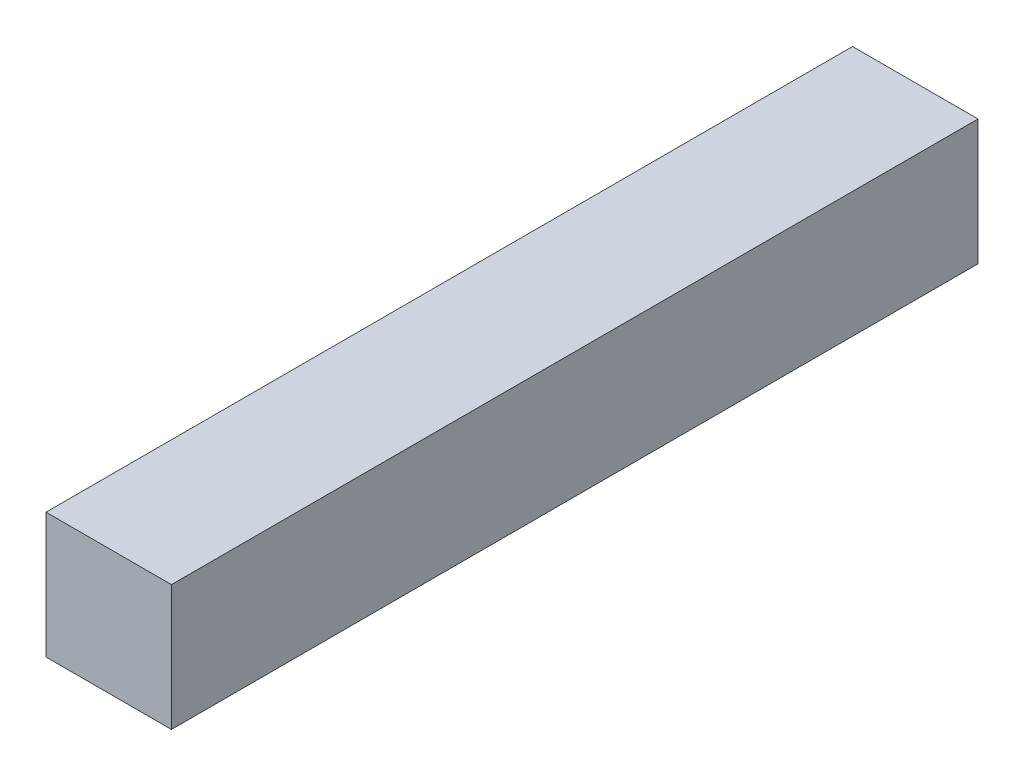
ISO-10303-21;
HEADER;
FILE_DESCRIPTION(('STEP AP214'),'2;1');
FILE_NAME('part.step','',(''),(''),'','','');
FILE_SCHEMA(('AUTOMOTIVE_DESIGN { 1 0 10303 214 1 1 1 1 }'));
ENDSEC;
DATA;
#1=APPLICATION_CONTEXT('core data for automotive mechanical design processes');
#2=APPLICATION_PROTOCOL_DEFINITION('international standard','automotive_design',2000,#1);
#3=PRODUCT_CONTEXT('',#1,'mechanical');
#4=PRODUCT('Part','Part','',(#3));
#5=PRODUCT_RELATED_PRODUCT_CATEGORY('part','',(#4));
#6=PRODUCT_DEFINITION_FORMATION('','',#4);
#7=PRODUCT_DEFINITION_CONTEXT('part definition',#1,'design');
#8=PRODUCT_DEFINITION('design','',#6,#7);
#9=PRODUCT_DEFINITION_SHAPE('','',#8);
#10=(LENGTH_UNIT() NAMED_UNIT(*) SI_UNIT(.MILLI.,.METRE.));
#11=(NAMED_UNIT(*) PLANE_ANGLE_UNIT() SI_UNIT($,.RADIAN.));
#12=(NAMED_UNIT(*) SI_UNIT($,.STERADIAN.) SOLID_ANGLE_UNIT());
#13=UNCERTAINTY_MEASURE_WITH_UNIT(LENGTH_MEASURE(1.E-05),#10,'distance_accuracy_value','');
#14=(GEOMETRIC_REPRESENTATION_CONTEXT(3) GLOBAL_UNCERTAINTY_ASSIGNED_CONTEXT((#13)) GLOBAL_UNIT_ASSIGNED_CONTEXT((#10,
#11,#12)) REPRESENTATION_CONTEXT('',''));
#15=CARTESIAN_POINT('',(0.,0.,0.));
#16=DIRECTION('',(0.,0.,1.));
#17=DIRECTION('',(1.,0.,0.));
#18=AXIS2_PLACEMENT_3D('',#15,#16,#17);
#19=CARTESIAN_POINT('',(0.,0.,18.));
#20=DIRECTION('',(1.,0.,0.));
#21=DIRECTION('',(0.,1.,0.));
#22=AXIS2_PLACEMENT_3D('',#19,#20,#21);
#23=PLANE('',#22);
#24=DIRECTION('',(0.,-1.,0.));
#25=VECTOR('',#24,1.);
#26=CARTESIAN_POINT('',(0.,0.,0.));
#27=LINE('',#26,#25);
#28=CARTESIAN_POINT('',(0.,2.8,0.));
#29=VERTEX_POINT('',#28);
#30=CARTESIAN_POINT('',(0.,0.,0.));
#31=VERTEX_POINT('',#30);
#32=EDGE_CURVE('E102',#29,#31,#27,.T.);
#33=ORIENTED_EDGE('',*,*,#32,.T.);
#34=DIRECTION('',(0.,0.,-1.));
#35=VECTOR('',#34,1.);
#36=CARTESIAN_POINT('',(0.,0.,18.));
#37=LINE('',#36,#35);
#38=CARTESIAN_POINT('',(0.,0.,18.));
#39=VERTEX_POINT('',#38);
#40=EDGE_CURVE('E11',#39,#31,#37,.T.);
#41=ORIENTED_EDGE('',*,*,#40,.F.);
#42=DIRECTION('',(0.,-1.,0.));
#43=VECTOR('',#42,1.);
#44=CARTESIAN_POINT('',(0.,0.,18.));
#45=LINE('',#44,#43);
#46=CARTESIAN_POINT('',(0.,2.8,18.));
#47=VERTEX_POINT('',#46);
#48=EDGE_CURVE('E90',#47,#39,#45,.T.);
#49=ORIENTED_EDGE('',*,*,#48,.F.);
#50=DIRECTION('',(0.,0.,-1.));
#51=VECTOR('',#50,1.);
#52=CARTESIAN_POINT('',(0.,2.8,18.));
#53=LINE('',#52,#51);
#54=EDGE_CURVE('E98',#47,#29,#53,.T.);
#55=ORIENTED_EDGE('',*,*,#54,.T.);
#56=EDGE_LOOP('',(#33,#41,#49,#55));
#57=FACE_BOUND('',#56,.T.);
#58=ADVANCED_FACE('F39',(#57),#23,.F.);
#59=CARTESIAN_POINT('',(0.,0.,18.));
#60=DIRECTION('',(0.,1.,0.));
#61=DIRECTION('',(0.,0.,1.));
#62=AXIS2_PLACEMENT_3D('',#59,#60,#61);
#63=PLANE('',#62);
#64=DIRECTION('',(1.,0.,0.));
#65=VECTOR('',#64,1.);
#66=CARTESIAN_POINT('',(0.,0.,0.));
#67=LINE('',#66,#65);
#68=CARTESIAN_POINT('',(2.8,0.,0.));
#69=VERTEX_POINT('',#68);
#70=EDGE_CURVE('E94',#31,#69,#67,.T.);
#71=ORIENTED_EDGE('',*,*,#70,.T.);
#72=DIRECTION('',(0.,0.,-1.));
#73=VECTOR('',#72,1.);
#74=CARTESIAN_POINT('',(2.8,0.,18.));
#75=LINE('',#74,#73);
#76=CARTESIAN_POINT('',(2.8,0.,18.));
#77=VERTEX_POINT('',#76);
#78=EDGE_CURVE('E47',#77,#69,#75,.T.);
#79=ORIENTED_EDGE('',*,*,#78,.F.);
#80=DIRECTION('',(1.,0.,0.));
#81=VECTOR('',#80,1.);
#82=CARTESIAN_POINT('',(0.,0.,18.));
#83=LINE('',#82,#81);
#84=EDGE_CURVE('E85',#39,#77,#83,.T.);
#85=ORIENTED_EDGE('',*,*,#84,.F.);
#86=ORIENTED_EDGE('',*,*,#40,.T.);
#87=EDGE_LOOP('',(#71,#79,#85,#86));
#88=FACE_BOUND('',#87,.T.);
#89=ADVANCED_FACE('F93',(#88),#63,.F.);
#90=CARTESIAN_POINT('',(2.8,0.,18.));
#91=DIRECTION('',(-1.,0.,0.));
#92=DIRECTION('',(0.,-1.,0.));
#93=AXIS2_PLACEMENT_3D('',#90,#91,#92);
#94=PLANE('',#93);
#95=DIRECTION('',(0.,1.,0.));
#96=VECTOR('',#95,1.);
#97=CARTESIAN_POINT('',(2.8,0.,0.));
#98=LINE('',#97,#96);
#99=CARTESIAN_POINT('',(2.8,2.8,0.));
#100=VERTEX_POINT('',#99);
#101=EDGE_CURVE('E72',#69,#100,#98,.T.);
#102=ORIENTED_EDGE('',*,*,#101,.T.);
#103=DIRECTION('',(0.,0.,-1.));
#104=VECTOR('',#103,1.);
#105=CARTESIAN_POINT('',(2.8,2.8,18.));
#106=LINE('',#105,#104);
#107=CARTESIAN_POINT('',(2.8,2.8,18.));
#108=VERTEX_POINT('',#107);
#109=EDGE_CURVE('E95',#108,#100,#106,.T.);
#110=ORIENTED_EDGE('',*,*,#109,.F.);
#111=DIRECTION('',(0.,1.,0.));
#112=VECTOR('',#111,1.);
#113=CARTESIAN_POINT('',(2.8,0.,18.));
#114=LINE('',#113,#112);
#115=EDGE_CURVE('E88',#77,#108,#114,.T.);
#116=ORIENTED_EDGE('',*,*,#115,.F.);
#117=ORIENTED_EDGE('',*,*,#78,.T.);
#118=EDGE_LOOP('',(#102,#110,#116,#117));
#119=FACE_BOUND('',#118,.T.);
#120=ADVANCED_FACE('F96',(#119),#94,.F.);
#121=CARTESIAN_POINT('',(0.,2.8,18.));
#122=DIRECTION('',(0.,-1.,0.));
#123=DIRECTION('',(0.,0.,-1.));
#124=AXIS2_PLACEMENT_3D('',#121,#122,#123);
#125=PLANE('',#124);
#126=DIRECTION('',(-1.,0.,0.));
#127=VECTOR('',#126,1.);
#128=CARTESIAN_POINT('',(0.,2.8,0.));
#129=LINE('',#128,#127);
#130=EDGE_CURVE('E78',#100,#29,#129,.T.);
#131=ORIENTED_EDGE('',*,*,#130,.T.);
#132=ORIENTED_EDGE('',*,*,#54,.F.);
#133=DIRECTION('',(-1.,0.,0.));
#134=VECTOR('',#133,1.);
#135=CARTESIAN_POINT('',(0.,2.8,18.));
#136=LINE('',#135,#134);
#137=EDGE_CURVE('E55',#108,#47,#136,.T.);
#138=ORIENTED_EDGE('',*,*,#137,.F.);
#139=ORIENTED_EDGE('',*,*,#109,.T.);
#140=EDGE_LOOP('',(#131,#132,#138,#139));
#141=FACE_BOUND('',#140,.T.);
#142=ADVANCED_FACE('F109',(#141),#125,.F.);
#143=CARTESIAN_POINT('',(0.,0.,18.));
#144=DIRECTION('',(0.,0.,-1.));
#145=DIRECTION('',(-1.,0.,0.));
#146=AXIS2_PLACEMENT_3D('',#143,#144,#145);
#147=PLANE('',#146);
#148=ORIENTED_EDGE('',*,*,#48,.T.);
#149=ORIENTED_EDGE('',*,*,#84,.T.);
#150=ORIENTED_EDGE('',*,*,#115,.T.);
#151=ORIENTED_EDGE('',*,*,#137,.T.);
#152=EDGE_LOOP('',(#148,#149,#150,#151));
#153=FACE_BOUND('',#152,.T.);
#154=ADVANCED_FACE('F86',(#153),#147,.F.);
#155=CARTESIAN_POINT('',(0.,0.,0.));
#156=DIRECTION('',(0.,0.,-1.));
#157=DIRECTION('',(-1.,0.,0.));
#158=AXIS2_PLACEMENT_3D('',#155,#156,#157);
#159=PLANE('',#158);
#160=ORIENTED_EDGE('',*,*,#32,.F.);
#161=ORIENTED_EDGE('',*,*,#130,.F.);
#162=ORIENTED_EDGE('',*,*,#101,.F.);
#163=ORIENTED_EDGE('',*,*,#70,.F.);
#164=EDGE_LOOP('',(#160,#161,#162,#163));
#165=FACE_BOUND('',#164,.T.);
#166=ADVANCED_FACE('F112',(#165),#159,.T.);
#167=CLOSED_SHELL('',(#58,#89,#120,#142,#154,#166));
#168=MANIFOLD_SOLID_BREP('B2',#167);
#169=ADVANCED_BREP_SHAPE_REPRESENTATION('',(#18,#168),#14);
#170=SHAPE_DEFINITION_REPRESENTATION(#9,#169);
ENDSEC;
END-ISO-10303-21;
